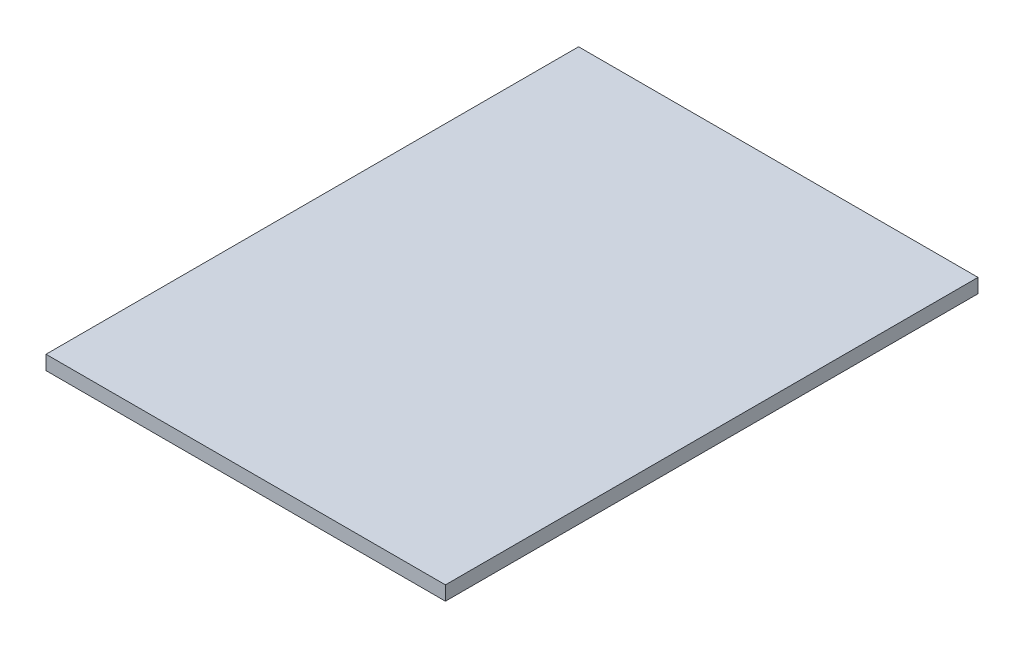
ISO-10303-21;
HEADER;
FILE_DESCRIPTION(('STEP AP214'),'2;1');
FILE_NAME('part.step','',(''),(''),'','','');
FILE_SCHEMA(('AUTOMOTIVE_DESIGN { 1 0 10303 214 1 1 1 1 }'));
ENDSEC;
DATA;
#1=APPLICATION_CONTEXT('core data for automotive mechanical design processes');
#2=APPLICATION_PROTOCOL_DEFINITION('international standard','automotive_design',2000,#1);
#3=PRODUCT_CONTEXT('',#1,'mechanical');
#4=PRODUCT('Part','Part','',(#3));
#5=PRODUCT_RELATED_PRODUCT_CATEGORY('part','',(#4));
#6=PRODUCT_DEFINITION_FORMATION('','',#4);
#7=PRODUCT_DEFINITION_CONTEXT('part definition',#1,'design');
#8=PRODUCT_DEFINITION('design','',#6,#7);
#9=PRODUCT_DEFINITION_SHAPE('','',#8);
#10=(LENGTH_UNIT() NAMED_UNIT(*) SI_UNIT(.MILLI.,.METRE.));
#11=(NAMED_UNIT(*) PLANE_ANGLE_UNIT() SI_UNIT($,.RADIAN.));
#12=(NAMED_UNIT(*) SI_UNIT($,.STERADIAN.) SOLID_ANGLE_UNIT());
#13=UNCERTAINTY_MEASURE_WITH_UNIT(LENGTH_MEASURE(1.E-05),#10,'distance_accuracy_value','');
#14=(GEOMETRIC_REPRESENTATION_CONTEXT(3) GLOBAL_UNCERTAINTY_ASSIGNED_CONTEXT((#13)) GLOBAL_UNIT_ASSIGNED_CONTEXT((#10,
#11,#12)) REPRESENTATION_CONTEXT('',''));
#15=CARTESIAN_POINT('',(0.,0.,0.));
#16=DIRECTION('',(0.,0.,1.));
#17=DIRECTION('',(1.,0.,0.));
#18=AXIS2_PLACEMENT_3D('',#15,#16,#17);
#19=CARTESIAN_POINT('',(-225.000000000001,16.,300.));
#20=DIRECTION('',(0.,0.,-1.));
#21=DIRECTION('',(-1.,0.,0.));
#22=AXIS2_PLACEMENT_3D('',#19,#20,#21);
#23=PLANE('',#22);
#24=DIRECTION('',(1.,0.,0.));
#25=VECTOR('',#24,1.);
#26=CARTESIAN_POINT('',(-225.000000000001,0.,300.));
#27=LINE('',#26,#25);
#28=CARTESIAN_POINT('',(-225.000000000001,0.,300.));
#29=VERTEX_POINT('',#28);
#30=CARTESIAN_POINT('',(225.000000000001,0.,300.));
#31=VERTEX_POINT('',#30);
#32=EDGE_CURVE('E102',#29,#31,#27,.T.);
#33=ORIENTED_EDGE('',*,*,#32,.T.);
#34=DIRECTION('',(0.,-1.,0.));
#35=VECTOR('',#34,1.);
#36=CARTESIAN_POINT('',(225.000000000001,16.,300.));
#37=LINE('',#36,#35);
#38=CARTESIAN_POINT('',(225.000000000001,16.,300.));
#39=VERTEX_POINT('',#38);
#40=EDGE_CURVE('E11',#39,#31,#37,.T.);
#41=ORIENTED_EDGE('',*,*,#40,.F.);
#42=DIRECTION('',(1.,0.,0.));
#43=VECTOR('',#42,1.);
#44=CARTESIAN_POINT('',(-225.000000000001,16.,300.));
#45=LINE('',#44,#43);
#46=CARTESIAN_POINT('',(-225.000000000001,16.,300.));
#47=VERTEX_POINT('',#46);
#48=EDGE_CURVE('E88',#47,#39,#45,.T.);
#49=ORIENTED_EDGE('',*,*,#48,.F.);
#50=DIRECTION('',(0.,-1.,0.));
#51=VECTOR('',#50,1.);
#52=CARTESIAN_POINT('',(-225.000000000001,16.,300.));
#53=LINE('',#52,#51);
#54=EDGE_CURVE('E55',#47,#29,#53,.T.);
#55=ORIENTED_EDGE('',*,*,#54,.T.);
#56=EDGE_LOOP('',(#33,#41,#49,#55));
#57=FACE_BOUND('',#56,.T.);
#58=ADVANCED_FACE('F39',(#57),#23,.F.);
#59=CARTESIAN_POINT('',(225.000000000001,16.,300.));
#60=DIRECTION('',(-1.,0.,0.));
#61=DIRECTION('',(0.,0.,1.));
#62=AXIS2_PLACEMENT_3D('',#59,#60,#61);
#63=PLANE('',#62);
#64=DIRECTION('',(0.,0.,-1.));
#65=VECTOR('',#64,1.);
#66=CARTESIAN_POINT('',(225.000000000001,0.,300.));
#67=LINE('',#66,#65);
#68=CARTESIAN_POINT('',(225.000000000001,0.,-300.));
#69=VERTEX_POINT('',#68);
#70=EDGE_CURVE('E93',#31,#69,#67,.T.);
#71=ORIENTED_EDGE('',*,*,#70,.T.);
#72=DIRECTION('',(0.,-1.,0.));
#73=VECTOR('',#72,1.);
#74=CARTESIAN_POINT('',(225.000000000001,16.,-300.));
#75=LINE('',#74,#73);
#76=CARTESIAN_POINT('',(225.000000000001,16.,-300.));
#77=VERTEX_POINT('',#76);
#78=EDGE_CURVE('E47',#77,#69,#75,.T.);
#79=ORIENTED_EDGE('',*,*,#78,.F.);
#80=DIRECTION('',(0.,0.,-1.));
#81=VECTOR('',#80,1.);
#82=CARTESIAN_POINT('',(225.000000000001,16.,300.));
#83=LINE('',#82,#81);
#84=EDGE_CURVE('E80',#39,#77,#83,.T.);
#85=ORIENTED_EDGE('',*,*,#84,.F.);
#86=ORIENTED_EDGE('',*,*,#40,.T.);
#87=EDGE_LOOP('',(#71,#79,#85,#86));
#88=FACE_BOUND('',#87,.T.);
#89=ADVANCED_FACE('F92',(#88),#63,.F.);
#90=CARTESIAN_POINT('',(-225.000000000001,16.,-300.));
#91=DIRECTION('',(0.,0.,-1.));
#92=DIRECTION('',(-1.,0.,0.));
#93=AXIS2_PLACEMENT_3D('',#90,#91,#92);
#94=PLANE('',#93);
#95=DIRECTION('',(1.,0.,0.));
#96=VECTOR('',#95,1.);
#97=CARTESIAN_POINT('',(-225.000000000001,0.,-300.));
#98=LINE('',#97,#96);
#99=CARTESIAN_POINT('',(-225.000000000001,0.,-300.));
#100=VERTEX_POINT('',#99);
#101=EDGE_CURVE('E105',#100,#69,#98,.T.);
#102=ORIENTED_EDGE('',*,*,#101,.F.);
#103=DIRECTION('',(0.,-1.,0.));
#104=VECTOR('',#103,1.);
#105=CARTESIAN_POINT('',(-225.000000000001,16.,-300.));
#106=LINE('',#105,#104);
#107=CARTESIAN_POINT('',(-225.000000000001,16.,-300.));
#108=VERTEX_POINT('',#107);
#109=EDGE_CURVE('E69',#108,#100,#106,.T.);
#110=ORIENTED_EDGE('',*,*,#109,.F.);
#111=DIRECTION('',(1.,0.,0.));
#112=VECTOR('',#111,1.);
#113=CARTESIAN_POINT('',(-225.000000000001,16.,-300.));
#114=LINE('',#113,#112);
#115=EDGE_CURVE('E87',#108,#77,#114,.T.);
#116=ORIENTED_EDGE('',*,*,#115,.T.);
#117=ORIENTED_EDGE('',*,*,#78,.T.);
#118=EDGE_LOOP('',(#102,#110,#116,#117));
#119=FACE_BOUND('',#118,.T.);
#120=ADVANCED_FACE('F96',(#119),#94,.T.);
#121=CARTESIAN_POINT('',(-225.000000000001,16.,300.));
#122=DIRECTION('',(-1.,0.,0.));
#123=DIRECTION('',(0.,0.,1.));
#124=AXIS2_PLACEMENT_3D('',#121,#122,#123);
#125=PLANE('',#124);
#126=DIRECTION('',(0.,0.,-1.));
#127=VECTOR('',#126,1.);
#128=CARTESIAN_POINT('',(-225.000000000001,0.,300.));
#129=LINE('',#128,#127);
#130=EDGE_CURVE('E107',#29,#100,#129,.T.);
#131=ORIENTED_EDGE('',*,*,#130,.F.);
#132=ORIENTED_EDGE('',*,*,#54,.F.);
#133=DIRECTION('',(0.,0.,-1.));
#134=VECTOR('',#133,1.);
#135=CARTESIAN_POINT('',(-225.000000000001,16.,300.));
#136=LINE('',#135,#134);
#137=EDGE_CURVE('E97',#47,#108,#136,.T.);
#138=ORIENTED_EDGE('',*,*,#137,.T.);
#139=ORIENTED_EDGE('',*,*,#109,.T.);
#140=EDGE_LOOP('',(#131,#132,#138,#139));
#141=FACE_BOUND('',#140,.T.);
#142=ADVANCED_FACE('F113',(#141),#125,.T.);
#143=CARTESIAN_POINT('',(0.,16.,0.));
#144=DIRECTION('',(0.,1.,0.));
#145=DIRECTION('',(0.,0.,1.));
#146=AXIS2_PLACEMENT_3D('',#143,#144,#145);
#147=PLANE('',#146);
#148=ORIENTED_EDGE('',*,*,#48,.T.);
#149=ORIENTED_EDGE('',*,*,#84,.T.);
#150=ORIENTED_EDGE('',*,*,#115,.F.);
#151=ORIENTED_EDGE('',*,*,#137,.F.);
#152=EDGE_LOOP('',(#148,#149,#150,#151));
#153=FACE_BOUND('',#152,.T.);
#154=ADVANCED_FACE('F84',(#153),#147,.T.);
#155=CARTESIAN_POINT('',(0.,0.,0.));
#156=DIRECTION('',(0.,1.,0.));
#157=DIRECTION('',(0.,0.,1.));
#158=AXIS2_PLACEMENT_3D('',#155,#156,#157);
#159=PLANE('',#158);
#160=ORIENTED_EDGE('',*,*,#32,.F.);
#161=ORIENTED_EDGE('',*,*,#130,.T.);
#162=ORIENTED_EDGE('',*,*,#101,.T.);
#163=ORIENTED_EDGE('',*,*,#70,.F.);
#164=EDGE_LOOP('',(#160,#161,#162,#163));
#165=FACE_BOUND('',#164,.T.);
#166=ADVANCED_FACE('F112',(#165),#159,.F.);
#167=CLOSED_SHELL('',(#58,#89,#120,#142,#154,#166));
#168=MANIFOLD_SOLID_BREP('B2',#167);
#169=ADVANCED_BREP_SHAPE_REPRESENTATION('',(#18,#168),#14);
#170=SHAPE_DEFINITION_REPRESENTATION(#9,#169);
ENDSEC;
END-ISO-10303-21;
